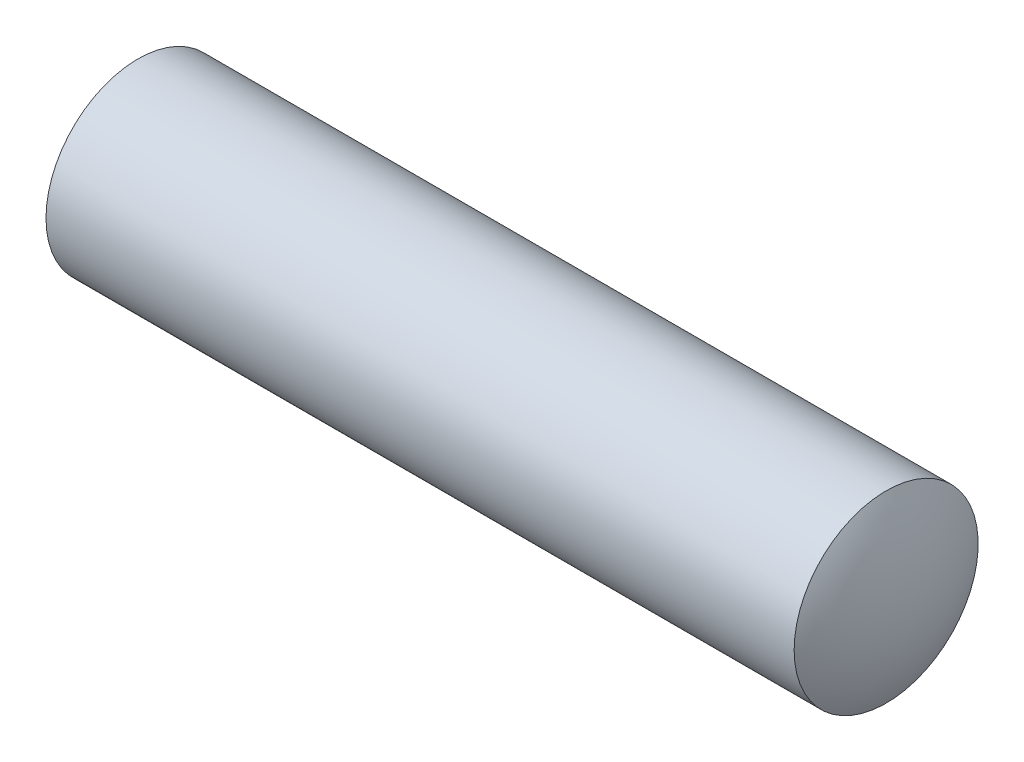
ISO-10303-21;
HEADER;
FILE_DESCRIPTION(('STEP AP214'),'2;1');
FILE_NAME('part.step','',(''),(''),'','','');
FILE_SCHEMA(('AUTOMOTIVE_DESIGN { 1 0 10303 214 1 1 1 1 }'));
ENDSEC;
DATA;
#1=APPLICATION_CONTEXT('core data for automotive mechanical design processes');
#2=APPLICATION_PROTOCOL_DEFINITION('international standard','automotive_design',2000,#1);
#3=PRODUCT_CONTEXT('',#1,'mechanical');
#4=PRODUCT('Part','Part','',(#3));
#5=PRODUCT_RELATED_PRODUCT_CATEGORY('part','',(#4));
#6=PRODUCT_DEFINITION_FORMATION('','',#4);
#7=PRODUCT_DEFINITION_CONTEXT('part definition',#1,'design');
#8=PRODUCT_DEFINITION('design','',#6,#7);
#9=PRODUCT_DEFINITION_SHAPE('','',#8);
#10=(LENGTH_UNIT() NAMED_UNIT(*) SI_UNIT(.MILLI.,.METRE.));
#11=(NAMED_UNIT(*) PLANE_ANGLE_UNIT() SI_UNIT($,.RADIAN.));
#12=(NAMED_UNIT(*) SI_UNIT($,.STERADIAN.) SOLID_ANGLE_UNIT());
#13=UNCERTAINTY_MEASURE_WITH_UNIT(LENGTH_MEASURE(1.E-05),#10,'distance_accuracy_value','');
#14=(GEOMETRIC_REPRESENTATION_CONTEXT(3) GLOBAL_UNCERTAINTY_ASSIGNED_CONTEXT((#13)) GLOBAL_UNIT_ASSIGNED_CONTEXT((#10,
#11,#12)) REPRESENTATION_CONTEXT('',''));
#15=CARTESIAN_POINT('',(0.,0.,0.));
#16=DIRECTION('',(0.,0.,1.));
#17=DIRECTION('',(1.,0.,0.));
#18=AXIS2_PLACEMENT_3D('',#15,#16,#17);
#19=CARTESIAN_POINT('',(6.,0.,0.));
#20=DIRECTION('',(0.,0.,1.));
#21=DIRECTION('',(1.,0.,0.));
#22=AXIS2_PLACEMENT_3D('',#19,#20,#21);
#23=SPHERICAL_SURFACE('',#22,6.);
#24=CARTESIAN_POINT('',(6.,0.,0.));
#25=DIRECTION('',(-1.,0.,0.));
#26=DIRECTION('',(0.,0.,1.));
#27=AXIS2_PLACEMENT_3D('',#24,#25,#26);
#28=SPHERICAL_SURFACE('',#27,6.);
#29=CARTESIAN_POINT('',(0.803847577293335,0.,0.));
#30=DIRECTION('',(-1.,0.,0.));
#31=DIRECTION('',(0.,0.,1.));
#32=AXIS2_PLACEMENT_3D('',#29,#30,#31);
#33=CIRCLE('',#32,3.);
#34=CARTESIAN_POINT('',(0.803847577293335,0.,3.00000000000003));
#35=VERTEX_POINT('',#34);
#36=EDGE_CURVE('E37',#35,#35,#33,.T.);
#37=ORIENTED_EDGE('',*,*,#36,.T.);
#38=EDGE_LOOP('',(#37));
#39=FACE_BOUND('',#38,.T.);
#40=ADVANCED_FACE('F31',(#39),#28,.T.);
#41=CARTESIAN_POINT('',(20.,0.,0.));
#42=DIRECTION('',(0.,0.,1.));
#43=DIRECTION('',(1.,0.,0.));
#44=AXIS2_PLACEMENT_3D('',#41,#42,#43);
#45=SPHERICAL_SURFACE('',#44,6.);
#46=CARTESIAN_POINT('',(20.,0.,0.));
#47=DIRECTION('',(-1.,0.,0.));
#48=DIRECTION('',(0.,0.,1.));
#49=AXIS2_PLACEMENT_3D('',#46,#47,#48);
#50=SPHERICAL_SURFACE('',#49,6.);
#51=CARTESIAN_POINT('',(25.1961524227066,0.,0.));
#52=DIRECTION('',(-1.,0.,0.));
#53=DIRECTION('',(0.,0.,1.));
#54=AXIS2_PLACEMENT_3D('',#51,#52,#53);
#55=CIRCLE('',#54,3.);
#56=CARTESIAN_POINT('',(25.1961524227066,0.,3.00000000000004));
#57=VERTEX_POINT('',#56);
#58=EDGE_CURVE('E10',#57,#57,#55,.T.);
#59=ORIENTED_EDGE('',*,*,#58,.F.);
#60=EDGE_LOOP('',(#59));
#61=FACE_BOUND('',#60,.T.);
#62=ADVANCED_FACE('F46',(#61),#50,.T.);
#63=CARTESIAN_POINT('',(0.,0.,0.));
#64=DIRECTION('',(-1.,0.,0.));
#65=DIRECTION('',(0.,0.,1.));
#66=AXIS2_PLACEMENT_3D('',#63,#64,#65);
#67=CYLINDRICAL_SURFACE('',#66,3.);
#68=ORIENTED_EDGE('',*,*,#58,.T.);
#69=EDGE_LOOP('',(#68));
#70=FACE_BOUND('',#69,.T.);
#71=ORIENTED_EDGE('',*,*,#36,.F.);
#72=EDGE_LOOP('',(#71));
#73=FACE_BOUND('',#72,.T.);
#74=ADVANCED_FACE('F44',(#70,#73),#67,.T.);
#75=CLOSED_SHELL('',(#40,#62,#74));
#76=MANIFOLD_SOLID_BREP('B2',#75);
#77=ADVANCED_BREP_SHAPE_REPRESENTATION('',(#18,#76),#14);
#78=SHAPE_DEFINITION_REPRESENTATION(#9,#77);
ENDSEC;
END-ISO-10303-21;
